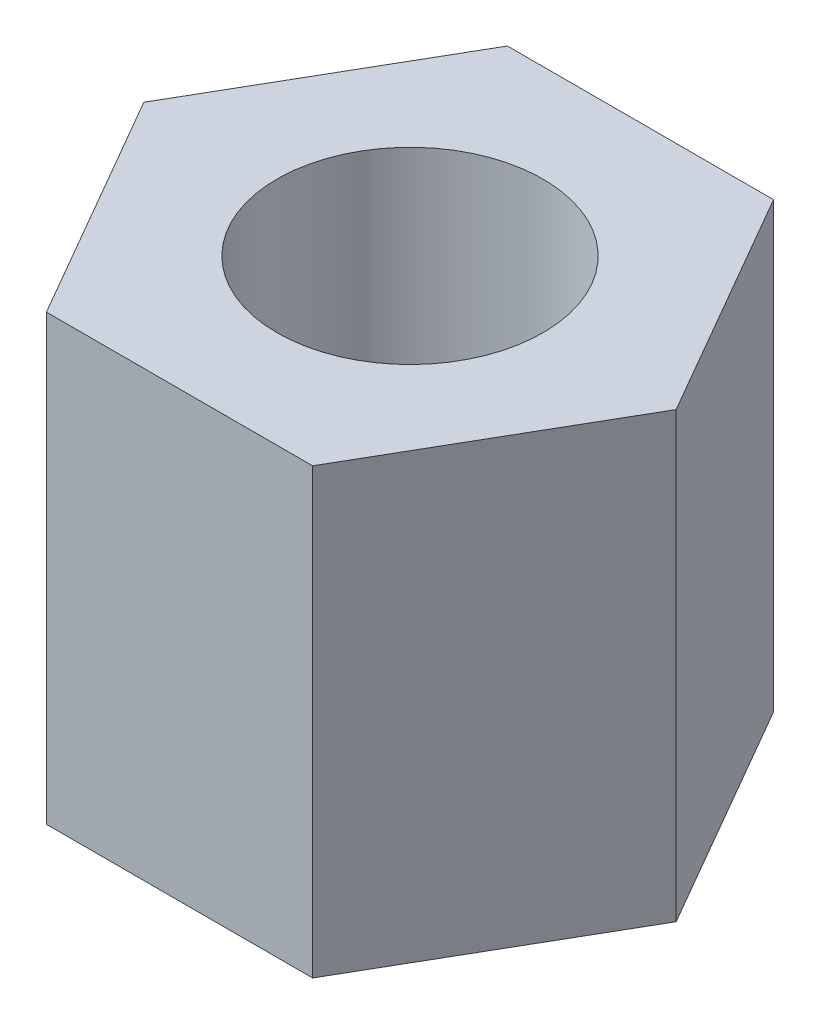
ISO-10303-21;
HEADER;
FILE_DESCRIPTION(('STEP AP214'),'2;1');
FILE_NAME('part.step','',(''),(''),'','','');
FILE_SCHEMA(('AUTOMOTIVE_DESIGN { 1 0 10303 214 1 1 1 1 }'));
ENDSEC;
DATA;
#1=APPLICATION_CONTEXT('core data for automotive mechanical design processes');
#2=APPLICATION_PROTOCOL_DEFINITION('international standard','automotive_design',2000,#1);
#3=PRODUCT_CONTEXT('',#1,'mechanical');
#4=PRODUCT('Part','Part','',(#3));
#5=PRODUCT_RELATED_PRODUCT_CATEGORY('part','',(#4));
#6=PRODUCT_DEFINITION_FORMATION('','',#4);
#7=PRODUCT_DEFINITION_CONTEXT('part definition',#1,'design');
#8=PRODUCT_DEFINITION('design','',#6,#7);
#9=PRODUCT_DEFINITION_SHAPE('','',#8);
#10=(LENGTH_UNIT() NAMED_UNIT(*) SI_UNIT(.MILLI.,.METRE.));
#11=(NAMED_UNIT(*) PLANE_ANGLE_UNIT() SI_UNIT($,.RADIAN.));
#12=(NAMED_UNIT(*) SI_UNIT($,.STERADIAN.) SOLID_ANGLE_UNIT());
#13=UNCERTAINTY_MEASURE_WITH_UNIT(LENGTH_MEASURE(1.E-05),#10,'distance_accuracy_value','');
#14=(GEOMETRIC_REPRESENTATION_CONTEXT(3) GLOBAL_UNCERTAINTY_ASSIGNED_CONTEXT((#13)) GLOBAL_UNIT_ASSIGNED_CONTEXT((#10,
#11,#12)) REPRESENTATION_CONTEXT('',''));
#15=CARTESIAN_POINT('',(0.,0.,0.));
#16=DIRECTION('',(0.,0.,1.));
#17=DIRECTION('',(1.,0.,0.));
#18=AXIS2_PLACEMENT_3D('',#15,#16,#17);
#19=CARTESIAN_POINT('',(0.,10.,0.));
#20=DIRECTION('',(0.,1.,0.));
#21=DIRECTION('',(0.,0.,1.));
#22=AXIS2_PLACEMENT_3D('',#19,#20,#21);
#23=PLANE('',#22);
#24=DIRECTION('',(-0.5,0.,0.866025403784439));
#25=VECTOR('',#24,1.);
#26=CARTESIAN_POINT('',(-3.,10.,-5.19615242270663));
#27=LINE('',#26,#25);
#28=CARTESIAN_POINT('',(-3.,10.,-5.19615242270663));
#29=VERTEX_POINT('',#28);
#30=CARTESIAN_POINT('',(-6.,10.,0.));
#31=VERTEX_POINT('',#30);
#32=EDGE_CURVE('E143',#29,#31,#27,.T.);
#33=ORIENTED_EDGE('',*,*,#32,.T.);
#34=DIRECTION('',(0.5,0.,0.866025403784439));
#35=VECTOR('',#34,1.);
#36=CARTESIAN_POINT('',(-6.,10.,0.));
#37=LINE('',#36,#35);
#38=CARTESIAN_POINT('',(-3.,10.,5.19615242270663));
#39=VERTEX_POINT('',#38);
#40=EDGE_CURVE('E97',#31,#39,#37,.T.);
#41=ORIENTED_EDGE('',*,*,#40,.T.);
#42=DIRECTION('',(1.,0.,0.));
#43=VECTOR('',#42,1.);
#44=CARTESIAN_POINT('',(-3.,10.,5.19615242270663));
#45=LINE('',#44,#43);
#46=CARTESIAN_POINT('',(3.,10.,5.19615242270663));
#47=VERTEX_POINT('',#46);
#48=EDGE_CURVE('E115',#39,#47,#45,.T.);
#49=ORIENTED_EDGE('',*,*,#48,.T.);
#50=DIRECTION('',(0.5,0.,-0.866025403784439));
#51=VECTOR('',#50,1.);
#52=CARTESIAN_POINT('',(3.,10.,5.19615242270663));
#53=LINE('',#52,#51);
#54=CARTESIAN_POINT('',(6.,10.,0.));
#55=VERTEX_POINT('',#54);
#56=EDGE_CURVE('E106',#47,#55,#53,.T.);
#57=ORIENTED_EDGE('',*,*,#56,.T.);
#58=DIRECTION('',(-0.5,0.,-0.866025403784439));
#59=VECTOR('',#58,1.);
#60=CARTESIAN_POINT('',(6.,10.,0.));
#61=LINE('',#60,#59);
#62=CARTESIAN_POINT('',(3.,10.,-5.19615242270663));
#63=VERTEX_POINT('',#62);
#64=EDGE_CURVE('E109',#55,#63,#61,.T.);
#65=ORIENTED_EDGE('',*,*,#64,.T.);
#66=DIRECTION('',(-1.,0.,0.));
#67=VECTOR('',#66,1.);
#68=CARTESIAN_POINT('',(3.,10.,-5.19615242270663));
#69=LINE('',#68,#67);
#70=EDGE_CURVE('E65',#63,#29,#69,.T.);
#71=ORIENTED_EDGE('',*,*,#70,.T.);
#72=EDGE_LOOP('',(#33,#41,#49,#57,#65,#71));
#73=FACE_BOUND('',#72,.T.);
#74=CARTESIAN_POINT('',(0.,10.,0.));
#75=DIRECTION('',(0.,1.,0.));
#76=DIRECTION('',(0.,0.,1.));
#77=AXIS2_PLACEMENT_3D('',#74,#75,#76);
#78=CIRCLE('',#77,3.);
#79=CARTESIAN_POINT('',(0.,10.,3.));
#80=VERTEX_POINT('',#79);
#81=EDGE_CURVE('E133',#80,#80,#78,.T.);
#82=ORIENTED_EDGE('',*,*,#81,.F.);
#83=EDGE_LOOP('',(#82));
#84=FACE_BOUND('',#83,.T.);
#85=ADVANCED_FACE('F44',(#73,#84),#23,.T.);
#86=CARTESIAN_POINT('',(0.,0.,0.));
#87=DIRECTION('',(0.,1.,0.));
#88=DIRECTION('',(0.,0.,1.));
#89=AXIS2_PLACEMENT_3D('',#86,#87,#88);
#90=PLANE('',#89);
#91=DIRECTION('',(-0.5,0.,0.866025403784439));
#92=VECTOR('',#91,1.);
#93=CARTESIAN_POINT('',(-3.,0.,-5.19615242270663));
#94=LINE('',#93,#92);
#95=CARTESIAN_POINT('',(-3.,0.,-5.19615242270663));
#96=VERTEX_POINT('',#95);
#97=CARTESIAN_POINT('',(-6.,0.,0.));
#98=VERTEX_POINT('',#97);
#99=EDGE_CURVE('E128',#96,#98,#94,.T.);
#100=ORIENTED_EDGE('',*,*,#99,.F.);
#101=DIRECTION('',(-1.,0.,0.));
#102=VECTOR('',#101,1.);
#103=CARTESIAN_POINT('',(3.,0.,-5.19615242270663));
#104=LINE('',#103,#102);
#105=CARTESIAN_POINT('',(3.,0.,-5.19615242270663));
#106=VERTEX_POINT('',#105);
#107=EDGE_CURVE('E93',#106,#96,#104,.T.);
#108=ORIENTED_EDGE('',*,*,#107,.F.);
#109=DIRECTION('',(-0.5,0.,-0.866025403784439));
#110=VECTOR('',#109,1.);
#111=CARTESIAN_POINT('',(6.,0.,0.));
#112=LINE('',#111,#110);
#113=CARTESIAN_POINT('',(6.,0.,0.));
#114=VERTEX_POINT('',#113);
#115=EDGE_CURVE('E83',#114,#106,#112,.T.);
#116=ORIENTED_EDGE('',*,*,#115,.F.);
#117=DIRECTION('',(0.5,0.,-0.866025403784439));
#118=VECTOR('',#117,1.);
#119=CARTESIAN_POINT('',(3.,0.,5.19615242270663));
#120=LINE('',#119,#118);
#121=CARTESIAN_POINT('',(3.,0.,5.19615242270663));
#122=VERTEX_POINT('',#121);
#123=EDGE_CURVE('E119',#122,#114,#120,.T.);
#124=ORIENTED_EDGE('',*,*,#123,.F.);
#125=DIRECTION('',(1.,0.,0.));
#126=VECTOR('',#125,1.);
#127=CARTESIAN_POINT('',(-3.,0.,5.19615242270663));
#128=LINE('',#127,#126);
#129=CARTESIAN_POINT('',(-3.,0.,5.19615242270663));
#130=VERTEX_POINT('',#129);
#131=EDGE_CURVE('E137',#130,#122,#128,.T.);
#132=ORIENTED_EDGE('',*,*,#131,.F.);
#133=DIRECTION('',(0.5,0.,0.866025403784439));
#134=VECTOR('',#133,1.);
#135=CARTESIAN_POINT('',(-6.,0.,0.));
#136=LINE('',#135,#134);
#137=EDGE_CURVE('E132',#98,#130,#136,.T.);
#138=ORIENTED_EDGE('',*,*,#137,.F.);
#139=EDGE_LOOP('',(#100,#108,#116,#124,#132,#138));
#140=FACE_BOUND('',#139,.T.);
#141=CARTESIAN_POINT('',(0.,0.,0.));
#142=DIRECTION('',(0.,1.,0.));
#143=DIRECTION('',(0.,0.,1.));
#144=AXIS2_PLACEMENT_3D('',#141,#142,#143);
#145=CIRCLE('',#144,3.);
#146=CARTESIAN_POINT('',(0.,0.,3.));
#147=VERTEX_POINT('',#146);
#148=EDGE_CURVE('E269',#147,#147,#145,.T.);
#149=ORIENTED_EDGE('',*,*,#148,.T.);
#150=EDGE_LOOP('',(#149));
#151=FACE_BOUND('',#150,.T.);
#152=ADVANCED_FACE('F147',(#140,#151),#90,.F.);
#153=CARTESIAN_POINT('',(-3.,10.,-5.19615242270663));
#154=DIRECTION('',(0.866025403784439,0.,0.5));
#155=DIRECTION('',(0.5,0.,-0.866025403784439));
#156=AXIS2_PLACEMENT_3D('',#153,#154,#155);
#157=PLANE('',#156);
#158=ORIENTED_EDGE('',*,*,#99,.T.);
#159=DIRECTION('',(0.,-1.,0.));
#160=VECTOR('',#159,1.);
#161=CARTESIAN_POINT('',(-6.,10.,0.));
#162=LINE('',#161,#160);
#163=EDGE_CURVE('E11',#31,#98,#162,.T.);
#164=ORIENTED_EDGE('',*,*,#163,.F.);
#165=ORIENTED_EDGE('',*,*,#32,.F.);
#166=DIRECTION('',(0.,-1.,0.));
#167=VECTOR('',#166,1.);
#168=CARTESIAN_POINT('',(-3.,10.,-5.19615242270663));
#169=LINE('',#168,#167);
#170=EDGE_CURVE('E127',#29,#96,#169,.T.);
#171=ORIENTED_EDGE('',*,*,#170,.T.);
#172=EDGE_LOOP('',(#158,#164,#165,#171));
#173=FACE_BOUND('',#172,.T.);
#174=ADVANCED_FACE('F50',(#173),#157,.F.);
#175=CARTESIAN_POINT('',(-6.,10.,0.));
#176=DIRECTION('',(0.866025403784439,0.,-0.5));
#177=DIRECTION('',(-0.5,0.,-0.866025403784439));
#178=AXIS2_PLACEMENT_3D('',#175,#176,#177);
#179=PLANE('',#178);
#180=ORIENTED_EDGE('',*,*,#137,.T.);
#181=DIRECTION('',(0.,-1.,0.));
#182=VECTOR('',#181,1.);
#183=CARTESIAN_POINT('',(-3.,10.,5.19615242270663));
#184=LINE('',#183,#182);
#185=EDGE_CURVE('E53',#39,#130,#184,.T.);
#186=ORIENTED_EDGE('',*,*,#185,.F.);
#187=ORIENTED_EDGE('',*,*,#40,.F.);
#188=ORIENTED_EDGE('',*,*,#163,.T.);
#189=EDGE_LOOP('',(#180,#186,#187,#188));
#190=FACE_BOUND('',#189,.T.);
#191=ADVANCED_FACE('F174',(#190),#179,.F.);
#192=CARTESIAN_POINT('',(-3.,10.,5.19615242270663));
#193=DIRECTION('',(0.,0.,-1.));
#194=DIRECTION('',(-1.,0.,0.));
#195=AXIS2_PLACEMENT_3D('',#192,#193,#194);
#196=PLANE('',#195);
#197=ORIENTED_EDGE('',*,*,#131,.T.);
#198=DIRECTION('',(0.,-1.,0.));
#199=VECTOR('',#198,1.);
#200=CARTESIAN_POINT('',(3.,10.,5.19615242270663));
#201=LINE('',#200,#199);
#202=EDGE_CURVE('E122',#47,#122,#201,.T.);
#203=ORIENTED_EDGE('',*,*,#202,.F.);
#204=ORIENTED_EDGE('',*,*,#48,.F.);
#205=ORIENTED_EDGE('',*,*,#185,.T.);
#206=EDGE_LOOP('',(#197,#203,#204,#205));
#207=FACE_BOUND('',#206,.T.);
#208=ADVANCED_FACE('F150',(#207),#196,.F.);
#209=CARTESIAN_POINT('',(3.,10.,5.19615242270663));
#210=DIRECTION('',(-0.866025403784439,0.,-0.5));
#211=DIRECTION('',(-0.5,0.,0.866025403784439));
#212=AXIS2_PLACEMENT_3D('',#209,#210,#211);
#213=PLANE('',#212);
#214=ORIENTED_EDGE('',*,*,#123,.T.);
#215=DIRECTION('',(0.,-1.,0.));
#216=VECTOR('',#215,1.);
#217=CARTESIAN_POINT('',(6.,10.,0.));
#218=LINE('',#217,#216);
#219=EDGE_CURVE('E120',#55,#114,#218,.T.);
#220=ORIENTED_EDGE('',*,*,#219,.F.);
#221=ORIENTED_EDGE('',*,*,#56,.F.);
#222=ORIENTED_EDGE('',*,*,#202,.T.);
#223=EDGE_LOOP('',(#214,#220,#221,#222));
#224=FACE_BOUND('',#223,.T.);
#225=ADVANCED_FACE('F117',(#224),#213,.F.);
#226=CARTESIAN_POINT('',(6.,10.,0.));
#227=DIRECTION('',(-0.866025403784439,0.,0.5));
#228=DIRECTION('',(0.5,0.,0.866025403784439));
#229=AXIS2_PLACEMENT_3D('',#226,#227,#228);
#230=PLANE('',#229);
#231=ORIENTED_EDGE('',*,*,#115,.T.);
#232=DIRECTION('',(0.,-1.,0.));
#233=VECTOR('',#232,1.);
#234=CARTESIAN_POINT('',(3.,10.,-5.19615242270663));
#235=LINE('',#234,#233);
#236=EDGE_CURVE('E124',#63,#106,#235,.T.);
#237=ORIENTED_EDGE('',*,*,#236,.F.);
#238=ORIENTED_EDGE('',*,*,#64,.F.);
#239=ORIENTED_EDGE('',*,*,#219,.T.);
#240=EDGE_LOOP('',(#231,#237,#238,#239));
#241=FACE_BOUND('',#240,.T.);
#242=ADVANCED_FACE('F121',(#241),#230,.F.);
#243=CARTESIAN_POINT('',(3.,10.,-5.19615242270663));
#244=DIRECTION('',(0.,0.,1.));
#245=DIRECTION('',(1.,0.,0.));
#246=AXIS2_PLACEMENT_3D('',#243,#244,#245);
#247=PLANE('',#246);
#248=ORIENTED_EDGE('',*,*,#107,.T.);
#249=ORIENTED_EDGE('',*,*,#170,.F.);
#250=ORIENTED_EDGE('',*,*,#70,.F.);
#251=ORIENTED_EDGE('',*,*,#236,.T.);
#252=EDGE_LOOP('',(#248,#249,#250,#251));
#253=FACE_BOUND('',#252,.T.);
#254=ADVANCED_FACE('F154',(#253),#247,.F.);
#255=CARTESIAN_POINT('',(0.,10.,0.));
#256=DIRECTION('',(0.,-1.,0.));
#257=DIRECTION('',(0.,0.,-1.));
#258=AXIS2_PLACEMENT_3D('',#255,#256,#257);
#259=CYLINDRICAL_SURFACE('',#258,3.);
#260=ORIENTED_EDGE('',*,*,#81,.T.);
#261=EDGE_LOOP('',(#260));
#262=FACE_BOUND('',#261,.T.);
#263=ORIENTED_EDGE('',*,*,#148,.F.);
#264=EDGE_LOOP('',(#263));
#265=FACE_BOUND('',#264,.T.);
#266=ADVANCED_FACE('F160',(#262,#265),#259,.F.);
#267=CLOSED_SHELL('',(#85,#152,#174,#191,#208,#225,#242,#254,#266));
#268=MANIFOLD_SOLID_BREP('B2',#267);
#269=ADVANCED_BREP_SHAPE_REPRESENTATION('',(#18,#268),#14);
#270=SHAPE_DEFINITION_REPRESENTATION(#9,#269);
ENDSEC;
END-ISO-10303-21;
